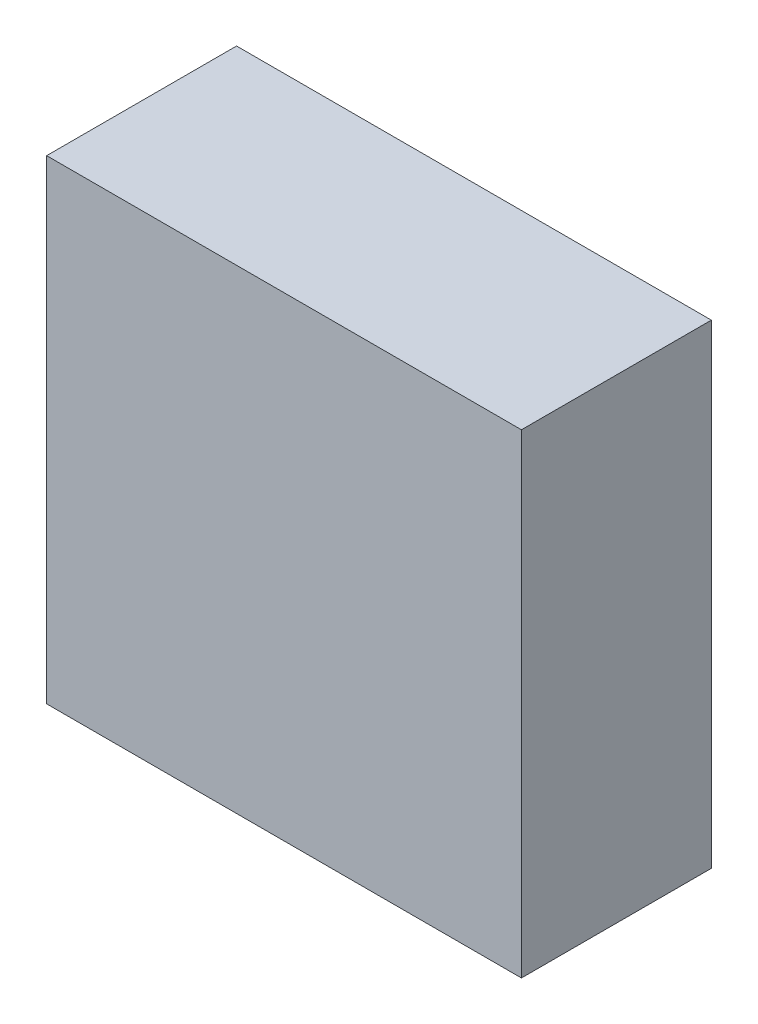
ISO-10303-21;
HEADER;
FILE_DESCRIPTION(('STEP AP214'),'2;1');
FILE_NAME('part.step','',(''),(''),'','','');
FILE_SCHEMA(('AUTOMOTIVE_DESIGN { 1 0 10303 214 1 1 1 1 }'));
ENDSEC;
DATA;
#1=APPLICATION_CONTEXT('core data for automotive mechanical design processes');
#2=APPLICATION_PROTOCOL_DEFINITION('international standard','automotive_design',2000,#1);
#3=PRODUCT_CONTEXT('',#1,'mechanical');
#4=PRODUCT('Part','Part','',(#3));
#5=PRODUCT_RELATED_PRODUCT_CATEGORY('part','',(#4));
#6=PRODUCT_DEFINITION_FORMATION('','',#4);
#7=PRODUCT_DEFINITION_CONTEXT('part definition',#1,'design');
#8=PRODUCT_DEFINITION('design','',#6,#7);
#9=PRODUCT_DEFINITION_SHAPE('','',#8);
#10=(LENGTH_UNIT() NAMED_UNIT(*) SI_UNIT(.MILLI.,.METRE.));
#11=(NAMED_UNIT(*) PLANE_ANGLE_UNIT() SI_UNIT($,.RADIAN.));
#12=(NAMED_UNIT(*) SI_UNIT($,.STERADIAN.) SOLID_ANGLE_UNIT());
#13=UNCERTAINTY_MEASURE_WITH_UNIT(LENGTH_MEASURE(1.E-05),#10,'distance_accuracy_value','');
#14=(GEOMETRIC_REPRESENTATION_CONTEXT(3) GLOBAL_UNCERTAINTY_ASSIGNED_CONTEXT((#13)) GLOBAL_UNIT_ASSIGNED_CONTEXT((#10,
#11,#12)) REPRESENTATION_CONTEXT('',''));
#15=CARTESIAN_POINT('',(0.,0.,0.));
#16=DIRECTION('',(0.,0.,1.));
#17=DIRECTION('',(1.,0.,0.));
#18=AXIS2_PLACEMENT_3D('',#15,#16,#17);
#19=CARTESIAN_POINT('',(25.9471990727128,3.78096775519939,-0.879999050681724));
#20=CARTESIAN_POINT('',(23.5471990727128,3.7809677838191,-0.879999050681722));
#21=CARTESIAN_POINT('',(25.9471990727128,3.78096767127356,0.0800009493182734));
#22=CARTESIAN_POINT('',(23.5471990727128,3.78096769989328,0.0800009493182759));
#23=(BOUNDED_SURFACE() B_SPLINE_SURFACE(1,1,((#19,#20),(#21,#22)),.UNSPECIFIED.,.F.,.F.,
.F.) B_SPLINE_SURFACE_WITH_KNOTS((2,2),(2,2),(-8.E-05,0.00088),(-0.0022,0.000200000000000007),
.UNSPECIFIED.) GEOMETRIC_REPRESENTATION_ITEM() RATIONAL_B_SPLINE_SURFACE(((1.,1.),(1.,1.))) REPRESENTATION_ITEM('') SURFACE());
#24=CARTESIAN_POINT('',(23.7471990727128,3.78096777444031,-0.799999050681722));
#25=CARTESIAN_POINT('',(25.7471990727128,3.78096775059055,-0.799999050681724));
#26=(BOUNDED_CURVE() B_SPLINE_CURVE(1,(#24,#25),.UNSPECIFIED.,.F.,
.F.) B_SPLINE_CURVE_WITH_KNOTS((2,2),(0.,0.002),
.UNSPECIFIED.) CURVE() GEOMETRIC_REPRESENTATION_ITEM() RATIONAL_B_SPLINE_CURVE((1.,1.)) REPRESENTATION_ITEM(''));
#27=CARTESIAN_POINT('',(23.7471990727128,3.78096777444031,-0.799999050681722));
#28=VERTEX_POINT('',#27);
#29=CARTESIAN_POINT('',(25.7471990727128,3.78096775059056,-0.799999050681724));
#30=VERTEX_POINT('',#29);
#31=EDGE_CURVE('E43',#28,#30,#26,.T.);
#32=CARTESIAN_POINT('',(25.7471990727128,3.78096768065236,9.49318273730376E-07));
#33=CARTESIAN_POINT('',(25.7471990727128,3.78096775059055,-0.799999050681724));
#34=(BOUNDED_CURVE() B_SPLINE_CURVE(1,(#32,#33),.UNSPECIFIED.,.F.,
.F.) B_SPLINE_CURVE_WITH_KNOTS((2,2),(0.,0.0008),
.UNSPECIFIED.) CURVE() GEOMETRIC_REPRESENTATION_ITEM() RATIONAL_B_SPLINE_CURVE((1.,1.)) REPRESENTATION_ITEM(''));
#35=CARTESIAN_POINT('',(25.7471990727128,3.78096768065236,9.49318273730376E-07));
#36=VERTEX_POINT('',#35);
#37=EDGE_CURVE('E128',#36,#30,#34,.T.);
#38=CARTESIAN_POINT('',(23.7471990727128,3.78096770450212,9.49318275898781E-07));
#39=CARTESIAN_POINT('',(25.7471990727128,3.78096768065236,9.4931827381377E-07));
#40=(BOUNDED_CURVE() B_SPLINE_CURVE(1,(#38,#39),.UNSPECIFIED.,.F.,
.F.) B_SPLINE_CURVE_WITH_KNOTS((2,2),(0.,0.002),
.UNSPECIFIED.) CURVE() GEOMETRIC_REPRESENTATION_ITEM() RATIONAL_B_SPLINE_CURVE((1.,1.)) REPRESENTATION_ITEM(''));
#41=CARTESIAN_POINT('',(23.7471990727128,3.78096770450212,9.49318275898781E-07));
#42=VERTEX_POINT('',#41);
#43=EDGE_CURVE('E91',#42,#36,#40,.T.);
#44=CARTESIAN_POINT('',(23.7471990727128,3.78096770450212,9.49318275898781E-07));
#45=CARTESIAN_POINT('',(23.7471990727128,3.78096777444031,-0.799999050681722));
#46=(BOUNDED_CURVE() B_SPLINE_CURVE(1,(#44,#45),.UNSPECIFIED.,.F.,
.F.) B_SPLINE_CURVE_WITH_KNOTS((2,2),(0.,0.0008),
.UNSPECIFIED.) CURVE() GEOMETRIC_REPRESENTATION_ITEM() RATIONAL_B_SPLINE_CURVE((1.,1.)) REPRESENTATION_ITEM(''));
#47=EDGE_CURVE('E11',#42,#28,#46,.T.);
#48=ORIENTED_EDGE('',*,*,#31,.T.);
#49=ORIENTED_EDGE('',*,*,#37,.F.);
#50=ORIENTED_EDGE('',*,*,#43,.F.);
#51=ORIENTED_EDGE('',*,*,#47,.T.);
#52=EDGE_LOOP('',(#48,#49,#50,#51));
#53=FACE_BOUND('',#52,.T.);
#54=ADVANCED_FACE('F17',(#53),#23,.T.);
#55=CARTESIAN_POINT('',(23.7471990703278,3.58096778143412,-0.879999068166268));
#56=CARTESIAN_POINT('',(23.7471990989475,5.98096778143414,-0.879998858351707));
#57=CARTESIAN_POINT('',(23.7471990703278,3.5809676975083,0.080000931833729));
#58=CARTESIAN_POINT('',(23.7471990989475,5.98096769750832,0.0800011416482905));
#59=(BOUNDED_SURFACE() B_SPLINE_SURFACE(1,1,((#55,#56),(#57,#58)),.UNSPECIFIED.,.F.,.F.,
.F.) B_SPLINE_SURFACE_WITH_KNOTS((2,2),(2,2),(-8.E-05,0.00088),(-0.000200000000000003,0.0022),
.UNSPECIFIED.) GEOMETRIC_REPRESENTATION_ITEM() RATIONAL_B_SPLINE_SURFACE(((1.,1.),(1.,1.))) REPRESENTATION_ITEM('') SURFACE());
#60=CARTESIAN_POINT('',(23.7471990965625,5.78096770450212,1.12416374386387E-06));
#61=CARTESIAN_POINT('',(23.7471990965625,5.78096777444031,-0.799998875836254));
#62=(BOUNDED_CURVE() B_SPLINE_CURVE(1,(#60,#61),.UNSPECIFIED.,.F.,
.F.) B_SPLINE_CURVE_WITH_KNOTS((2,2),(0.,0.0008),
.UNSPECIFIED.) CURVE() GEOMETRIC_REPRESENTATION_ITEM() RATIONAL_B_SPLINE_CURVE((1.,1.)) REPRESENTATION_ITEM(''));
#63=CARTESIAN_POINT('',(23.7471990965625,5.78096770450212,1.12416374386387E-06));
#64=VERTEX_POINT('',#63);
#65=CARTESIAN_POINT('',(23.7471990965625,5.78096777444032,-0.799998875836254));
#66=VERTEX_POINT('',#65);
#67=EDGE_CURVE('E104',#64,#66,#62,.T.);
#68=CARTESIAN_POINT('',(23.7471990727128,3.78096777444031,-0.799999050681722));
#69=CARTESIAN_POINT('',(23.7471990965626,5.78096777444032,-0.799998875836254));
#70=(BOUNDED_CURVE() B_SPLINE_CURVE(1,(#68,#69),.UNSPECIFIED.,.F.,
.F.) B_SPLINE_CURVE_WITH_KNOTS((2,2),(0.,0.002),
.UNSPECIFIED.) CURVE() GEOMETRIC_REPRESENTATION_ITEM() RATIONAL_B_SPLINE_CURVE((1.,1.)) REPRESENTATION_ITEM(''));
#71=EDGE_CURVE('E31',#28,#66,#70,.T.);
#72=CARTESIAN_POINT('',(23.7471990727128,3.78096770450212,9.49318275898781E-07));
#73=CARTESIAN_POINT('',(23.7471990965626,5.78096770450212,1.1241637437806E-06));
#74=(BOUNDED_CURVE() B_SPLINE_CURVE(1,(#72,#73),.UNSPECIFIED.,.F.,
.F.) B_SPLINE_CURVE_WITH_KNOTS((2,2),(0.,0.002),
.UNSPECIFIED.) CURVE() GEOMETRIC_REPRESENTATION_ITEM() RATIONAL_B_SPLINE_CURVE((1.,1.)) REPRESENTATION_ITEM(''));
#75=EDGE_CURVE('E93',#42,#64,#74,.T.);
#76=ORIENTED_EDGE('',*,*,#67,.T.);
#77=ORIENTED_EDGE('',*,*,#71,.F.);
#78=ORIENTED_EDGE('',*,*,#47,.F.);
#79=ORIENTED_EDGE('',*,*,#75,.T.);
#80=EDGE_LOOP('',(#76,#77,#78,#79));
#81=FACE_BOUND('',#80,.T.);
#82=ADVANCED_FACE('F351',(#81),#59,.T.);
#83=CARTESIAN_POINT('',(23.5471990703278,3.58096777682529,-0.799999068166268));
#84=CARTESIAN_POINT('',(25.9471990703278,3.58096774820557,-0.799999068166271));
#85=CARTESIAN_POINT('',(23.5471990989475,5.9809677768253,-0.799998858351707));
#86=CARTESIAN_POINT('',(25.9471990989475,5.98096774820558,-0.79999885835171));
#87=(BOUNDED_SURFACE() B_SPLINE_SURFACE(1,1,((#83,#84),(#85,#86)),.UNSPECIFIED.,.F.,.F.,
.F.) B_SPLINE_SURFACE_WITH_KNOTS((2,2),(2,2),(-0.0002,0.0022),(-0.000200000000000068,0.0022),
.UNSPECIFIED.) GEOMETRIC_REPRESENTATION_ITEM() RATIONAL_B_SPLINE_SURFACE(((1.,1.),(1.,1.))) REPRESENTATION_ITEM('') SURFACE());
#88=CARTESIAN_POINT('',(25.4138657448454,4.23930108789851,-0.79999901061297));
#89=CARTESIAN_POINT('',(25.5388657448454,4.23930108640791,-0.799999010612971));
#90=CARTESIAN_POINT('',(25.5388657433548,4.1143010864079,-0.799999021540812));
#91=CARTESIAN_POINT('',(25.5388657418642,3.9893010864079,-0.799999032468654));
#92=CARTESIAN_POINT('',(25.4138657418642,3.98930108789851,-0.799999032468654));
#93=(BOUNDED_CURVE() B_SPLINE_CURVE(2,(#88,#89,#90,#91,#92),.UNSPECIFIED.,.F.,
.F.) B_SPLINE_CURVE_WITH_KNOTS((3,2,3),(0.,1.57079632679488,3.14159265358981),
.UNSPECIFIED.) CURVE() GEOMETRIC_REPRESENTATION_ITEM() RATIONAL_B_SPLINE_CURVE((1.,
0.707106781186544,1.,0.70710678118653,1.)) REPRESENTATION_ITEM(''));
#94=CARTESIAN_POINT('',(25.4138657448454,4.23930108789851,-0.79999901061297));
#95=VERTEX_POINT('',#94);
#96=CARTESIAN_POINT('',(25.4138657418642,3.98930108789849,-0.799999032468654));
#97=VERTEX_POINT('',#96);
#98=EDGE_CURVE('E68',#95,#97,#93,.T.);
#99=CARTESIAN_POINT('',(25.4138657418642,3.98930108789851,-0.799999032468654));
#100=CARTESIAN_POINT('',(25.2888657418642,3.98930108938912,-0.799999032468654));
#101=CARTESIAN_POINT('',(25.2888657433548,4.11430108938912,-0.799999021540812));
#102=CARTESIAN_POINT('',(25.2888657448454,4.23930108938911,-0.79999901061297));
#103=CARTESIAN_POINT('',(25.4138657448454,4.23930108789851,-0.79999901061297));
#104=(BOUNDED_CURVE() B_SPLINE_CURVE(2,(#99,#100,#101,#102,#103),.UNSPECIFIED.,.F.,
.F.) B_SPLINE_CURVE_WITH_KNOTS((3,2,3),(3.14159265358981,4.71238898038467,6.28318530717953),
.UNSPECIFIED.) CURVE() GEOMETRIC_REPRESENTATION_ITEM() RATIONAL_B_SPLINE_CURVE((1.,
0.707106781186491,1.,0.707106781186478,1.)) REPRESENTATION_ITEM(''));
#105=EDGE_CURVE('E127',#97,#95,#104,.T.);
#106=CARTESIAN_POINT('',(23.7471990965625,5.78096777444032,-0.799998875836254));
#107=CARTESIAN_POINT('',(25.7471990965625,5.78096775059056,-0.799998875836256));
#108=(BOUNDED_CURVE() B_SPLINE_CURVE(1,(#106,#107),.UNSPECIFIED.,.F.,
.F.) B_SPLINE_CURVE_WITH_KNOTS((2,2),(0.,0.002),
.UNSPECIFIED.) CURVE() GEOMETRIC_REPRESENTATION_ITEM() RATIONAL_B_SPLINE_CURVE((1.,1.)) REPRESENTATION_ITEM(''));
#109=CARTESIAN_POINT('',(25.7471990965625,5.78096775059053,-0.799998875836256));
#110=VERTEX_POINT('',#109);
#111=EDGE_CURVE('E23',#66,#110,#108,.T.);
#112=CARTESIAN_POINT('',(25.7471990727128,3.78096775059056,-0.799999050681724));
#113=CARTESIAN_POINT('',(25.7471990965626,5.78096775059053,-0.799998875836256));
#114=(BOUNDED_CURVE() B_SPLINE_CURVE(1,(#112,#113),.UNSPECIFIED.,.F.,
.F.) B_SPLINE_CURVE_WITH_KNOTS((2,2),(0.,0.00199999999999997),
.UNSPECIFIED.) CURVE() GEOMETRIC_REPRESENTATION_ITEM() RATIONAL_B_SPLINE_CURVE((1.,1.)) REPRESENTATION_ITEM(''));
#115=EDGE_CURVE('E78',#30,#110,#114,.T.);
#116=ORIENTED_EDGE('',*,*,#98,.F.);
#117=ORIENTED_EDGE('',*,*,#105,.F.);
#118=EDGE_LOOP('',(#116,#117));
#119=FACE_BOUND('',#118,.T.);
#120=ORIENTED_EDGE('',*,*,#31,.F.);
#121=ORIENTED_EDGE('',*,*,#71,.T.);
#122=ORIENTED_EDGE('',*,*,#111,.T.);
#123=ORIENTED_EDGE('',*,*,#115,.F.);
#124=EDGE_LOOP('',(#120,#121,#122,#123));
#125=FACE_BOUND('',#124,.T.);
#126=ADVANCED_FACE('F19',(#119,#125),#87,.T.);
#127=CARTESIAN_POINT('',(25.7471990703278,3.58096767365854,0.0800009318337268));
#128=CARTESIAN_POINT('',(25.7471990989475,5.98096767365855,0.0800011416482883));
#129=CARTESIAN_POINT('',(25.7471990703278,3.58096775758436,-0.879999068166271));
#130=CARTESIAN_POINT('',(25.7471990989475,5.98096775758438,-0.879998858351709));
#131=(BOUNDED_SURFACE() B_SPLINE_SURFACE(1,1,((#127,#128),(#129,#130)),.UNSPECIFIED.,.F.,.F.,
.F.) B_SPLINE_SURFACE_WITH_KNOTS((2,2),(2,2),(-8.E-05,0.00088),(-0.000200000000000003,0.0022),
.UNSPECIFIED.) GEOMETRIC_REPRESENTATION_ITEM() RATIONAL_B_SPLINE_SURFACE(((1.,1.),(1.,1.))) REPRESENTATION_ITEM('') SURFACE());
#132=CARTESIAN_POINT('',(25.7471990727128,3.78096768065236,9.49318273730376E-07));
#133=CARTESIAN_POINT('',(25.7471990965626,5.78096768065237,1.1241637416122E-06));
#134=(BOUNDED_CURVE() B_SPLINE_CURVE(1,(#132,#133),.UNSPECIFIED.,.F.,
.F.) B_SPLINE_CURVE_WITH_KNOTS((2,2),(0.,0.002),
.UNSPECIFIED.) CURVE() GEOMETRIC_REPRESENTATION_ITEM() RATIONAL_B_SPLINE_CURVE((1.,1.)) REPRESENTATION_ITEM(''));
#135=CARTESIAN_POINT('',(25.7471990965625,5.78096768065237,1.12416374169547E-06));
#136=VERTEX_POINT('',#135);
#137=EDGE_CURVE('E85',#36,#136,#134,.T.);
#138=CARTESIAN_POINT('',(25.7471990965625,5.78096768065237,1.12416374169547E-06));
#139=CARTESIAN_POINT('',(25.7471990965625,5.78096775059056,-0.799998875836256));
#140=(BOUNDED_CURVE() B_SPLINE_CURVE(1,(#138,#139),.UNSPECIFIED.,.F.,
.F.) B_SPLINE_CURVE_WITH_KNOTS((2,2),(0.,0.0008),
.UNSPECIFIED.) CURVE() GEOMETRIC_REPRESENTATION_ITEM() RATIONAL_B_SPLINE_CURVE((1.,1.)) REPRESENTATION_ITEM(''));
#141=EDGE_CURVE('E96',#136,#110,#140,.T.);
#142=ORIENTED_EDGE('',*,*,#137,.F.);
#143=ORIENTED_EDGE('',*,*,#37,.T.);
#144=ORIENTED_EDGE('',*,*,#115,.T.);
#145=ORIENTED_EDGE('',*,*,#141,.F.);
#146=EDGE_LOOP('',(#142,#143,#144,#145));
#147=FACE_BOUND('',#146,.T.);
#148=ADVANCED_FACE('F97',(#147),#131,.T.);
#149=CARTESIAN_POINT('',(23.5471990989475,5.98096770688711,1.14164829077728E-06));
#150=CARTESIAN_POINT('',(25.9471990989475,5.98096767826739,1.14164828827527E-06));
#151=CARTESIAN_POINT('',(23.5471990703278,3.58096770688709,9.318337293191E-07));
#152=CARTESIAN_POINT('',(25.9471990703278,3.58096767826738,9.31833726817086E-07));
#153=(BOUNDED_SURFACE() B_SPLINE_SURFACE(1,1,((#149,#150),(#151,#152)),.UNSPECIFIED.,.F.,.F.,
.F.) B_SPLINE_SURFACE_WITH_KNOTS((2,2),(2,2),(-0.0002,0.0022),(-0.000200000000000069,0.0022),
.UNSPECIFIED.) GEOMETRIC_REPRESENTATION_ITEM() RATIONAL_B_SPLINE_SURFACE(((1.,1.),(1.,1.))) REPRESENTATION_ITEM('') SURFACE());
#154=CARTESIAN_POINT('',(23.7471990965625,5.78096770450212,1.12416374386387E-06));
#155=CARTESIAN_POINT('',(25.7471990965625,5.78096768065236,1.12416374177886E-06));
#156=(BOUNDED_CURVE() B_SPLINE_CURVE(1,(#154,#155),.UNSPECIFIED.,.F.,
.F.) B_SPLINE_CURVE_WITH_KNOTS((2,2),(0.,0.002),
.UNSPECIFIED.) CURVE() GEOMETRIC_REPRESENTATION_ITEM() RATIONAL_B_SPLINE_CURVE((1.,1.)) REPRESENTATION_ITEM(''));
#157=EDGE_CURVE('E89',#64,#136,#156,.T.);
#158=ORIENTED_EDGE('',*,*,#137,.T.);
#159=ORIENTED_EDGE('',*,*,#157,.F.);
#160=ORIENTED_EDGE('',*,*,#75,.F.);
#161=ORIENTED_EDGE('',*,*,#43,.T.);
#162=EDGE_LOOP('',(#158,#159,#160,#161));
#163=FACE_BOUND('',#162,.T.);
#164=ADVANCED_FACE('F86',(#163),#153,.T.);
#165=CARTESIAN_POINT('',(25.9471990965625,5.78096767127356,0.0800011241637414));
#166=CARTESIAN_POINT('',(23.5471990965625,5.78096769989328,0.0800011241637439));
#167=CARTESIAN_POINT('',(25.9471990965625,5.78096775519939,-0.879998875836256));
#168=CARTESIAN_POINT('',(23.5471990965625,5.7809677838191,-0.879998875836254));
#169=(BOUNDED_SURFACE() B_SPLINE_SURFACE(1,1,((#165,#166),(#167,#168)),.UNSPECIFIED.,.F.,.F.,
.F.) B_SPLINE_SURFACE_WITH_KNOTS((2,2),(2,2),(-8.E-05,0.00088),(-0.0022,0.0002),
.UNSPECIFIED.) GEOMETRIC_REPRESENTATION_ITEM() RATIONAL_B_SPLINE_SURFACE(((1.,1.),(1.,1.))) REPRESENTATION_ITEM('') SURFACE());
#170=ORIENTED_EDGE('',*,*,#67,.F.);
#171=ORIENTED_EDGE('',*,*,#157,.T.);
#172=ORIENTED_EDGE('',*,*,#141,.T.);
#173=ORIENTED_EDGE('',*,*,#111,.F.);
#174=EDGE_LOOP('',(#170,#171,#172,#173));
#175=FACE_BOUND('',#174,.T.);
#176=ADVANCED_FACE('F102',(#175),#169,.T.);
#177=CARTESIAN_POINT('',(25.4138657418642,3.98930107915622,-0.699999032468655));
#178=CARTESIAN_POINT('',(25.2888657418642,3.98930108064683,-0.699999032468654));
#179=CARTESIAN_POINT('',(25.2888657433548,4.11430108064683,-0.699999021540813));
#180=CARTESIAN_POINT('',(25.2888657448454,4.23930108064683,-0.699999010612971));
#181=CARTESIAN_POINT('',(25.4138657448454,4.23930107915622,-0.699999010612971));
#182=CARTESIAN_POINT('',(25.5388657448454,4.23930107766561,-0.699999010612971));
#183=CARTESIAN_POINT('',(25.5388657433548,4.11430107766561,-0.699999021540813));
#184=CARTESIAN_POINT('',(25.5388657418642,3.98930107766561,-0.699999032468656));
#185=CARTESIAN_POINT('',(25.4138657418642,3.98930107915622,-0.699999032468655));
#186=CARTESIAN_POINT('',(25.4138657418642,3.98930108789849,-0.799999032468654));
#187=CARTESIAN_POINT('',(25.2888657418642,3.98930108938911,-0.799999032468655));
#188=CARTESIAN_POINT('',(25.2888657433548,4.11430108938911,-0.799999021540812));
#189=CARTESIAN_POINT('',(25.2888657448454,4.23930108938911,-0.79999901061297));
#190=CARTESIAN_POINT('',(25.4138657448454,4.23930108789849,-0.79999901061297));
#191=CARTESIAN_POINT('',(25.5388657448454,4.23930108640788,-0.799999010612971));
#192=CARTESIAN_POINT('',(25.5388657433548,4.11430108640788,-0.799999021540812));
#193=CARTESIAN_POINT('',(25.5388657418642,3.98930108640788,-0.799999032468655));
#194=CARTESIAN_POINT('',(25.4138657418642,3.98930108789849,-0.799999032468654));
#195=(BOUNDED_SURFACE() B_SPLINE_SURFACE(1,2,((#177,#178,#179,#180,#181,#182,#183,#184,#185),
(#186,#187,#188,#189,#190,#191,#192,#193,#194)),.UNSPECIFIED.,.F.,.T.,
.F.) B_SPLINE_SURFACE_WITH_KNOTS((2,2),(3,2,2,2,3),(0.,0.8),(-3.14159265358979,-1.5707963267949,
0.,1.5707963267949,3.14159265358979),
.UNSPECIFIED.) GEOMETRIC_REPRESENTATION_ITEM() RATIONAL_B_SPLINE_SURFACE(((1.,0.707106781186548,
1.,0.707106781186548,1.,0.707106781186548,1.,0.707106781186548,1.),(1.,0.707106781186548,1.,
0.707106781186548,1.,0.707106781186548,1.,0.707106781186548,1.))) REPRESENTATION_ITEM('') SURFACE());
#196=CARTESIAN_POINT('',(25.4138657448454,4.23930107915622,-0.699999010612971));
#197=CARTESIAN_POINT('',(25.5388657448454,4.23930107766562,-0.699999010612971));
#198=CARTESIAN_POINT('',(25.5388657433548,4.11430107766561,-0.699999021540813));
#199=CARTESIAN_POINT('',(25.5388657418642,3.98930107766561,-0.699999032468655));
#200=CARTESIAN_POINT('',(25.4138657418642,3.98930107915622,-0.699999032468655));
#201=(BOUNDED_CURVE() B_SPLINE_CURVE(2,(#196,#197,#198,#199,#200),.UNSPECIFIED.,.F.,
.F.) B_SPLINE_CURVE_WITH_KNOTS((3,2,3),(0.,1.57079632679488,3.14159265358981),
.UNSPECIFIED.) CURVE() GEOMETRIC_REPRESENTATION_ITEM() RATIONAL_B_SPLINE_CURVE((1.,
0.707106781186544,1.,0.70710678118653,1.)) REPRESENTATION_ITEM(''));
#202=CARTESIAN_POINT('',(25.4138657448454,4.23930107915622,-0.699999010612971));
#203=VERTEX_POINT('',#202);
#204=CARTESIAN_POINT('',(25.4138657418642,3.98930107915622,-0.699999032468655));
#205=VERTEX_POINT('',#204);
#206=EDGE_CURVE('E150',#203,#205,#201,.T.);
#207=CARTESIAN_POINT('',(25.4138657418642,3.98930107915622,-0.699999032468655));
#208=CARTESIAN_POINT('',(25.2888657418642,3.98930108064683,-0.699999032468654));
#209=CARTESIAN_POINT('',(25.2888657433548,4.11430108064683,-0.699999021540813));
#210=CARTESIAN_POINT('',(25.2888657448454,4.23930108064682,-0.699999010612971));
#211=CARTESIAN_POINT('',(25.4138657448454,4.23930107915622,-0.699999010612971));
#212=(BOUNDED_CURVE() B_SPLINE_CURVE(2,(#207,#208,#209,#210,#211),.UNSPECIFIED.,.F.,
.F.) B_SPLINE_CURVE_WITH_KNOTS((3,2,3),(3.14159265358981,4.71238898038467,6.28318530717953),
.UNSPECIFIED.) CURVE() GEOMETRIC_REPRESENTATION_ITEM() RATIONAL_B_SPLINE_CURVE((1.,
0.707106781186504,1.,0.707106781186478,1.)) REPRESENTATION_ITEM(''));
#213=EDGE_CURVE('E143',#205,#203,#212,.T.);
#214=CARTESIAN_POINT('',(25.4138657418642,3.98930107915622,-0.699999032468655));
#215=CARTESIAN_POINT('',(25.4138657418642,3.98930108789849,-0.799999032468654));
#216=(BOUNDED_CURVE() B_SPLINE_CURVE(1,(#214,#215),.UNSPECIFIED.,.F.,
.F.) B_SPLINE_CURVE_WITH_KNOTS((2,2),(0.,0.8),
.UNSPECIFIED.) CURVE() GEOMETRIC_REPRESENTATION_ITEM() RATIONAL_B_SPLINE_CURVE((1.,1.)) REPRESENTATION_ITEM(''));
#217=EDGE_CURVE('E116',#205,#97,#216,.T.);
#218=ORIENTED_EDGE('',*,*,#206,.F.);
#219=ORIENTED_EDGE('',*,*,#213,.F.);
#220=ORIENTED_EDGE('',*,*,#217,.T.);
#221=ORIENTED_EDGE('',*,*,#105,.T.);
#222=ORIENTED_EDGE('',*,*,#98,.T.);
#223=ORIENTED_EDGE('',*,*,#217,.F.);
#224=EDGE_LOOP('',(#218,#219,#220,#221,#222,#223));
#225=FACE_BOUND('',#224,.T.);
#226=ADVANCED_FACE('F331',(#225),#195,.T.);
#227=CARTESIAN_POINT('',(25.2638657415661,3.96430108094494,-0.699999034654223));
#228=CARTESIAN_POINT('',(25.5638657415661,3.96430107736748,-0.699999034654223));
#229=CARTESIAN_POINT('',(25.2638657451435,4.26430108094496,-0.699999008427403));
#230=CARTESIAN_POINT('',(25.5638657451435,4.2643010773675,-0.699999008427403));
#231=(BOUNDED_SURFACE() B_SPLINE_SURFACE(1,1,((#227,#228),(#229,#230)),.UNSPECIFIED.,.F.,.F.,
.F.) B_SPLINE_SURFACE_WITH_KNOTS((2,2),(2,2),(-0.000150000000000007,0.000150000000000008),
(-0.000150000000000009,0.000150000000000012),
.UNSPECIFIED.) GEOMETRIC_REPRESENTATION_ITEM() RATIONAL_B_SPLINE_SURFACE(((1.,1.),(1.,1.))) REPRESENTATION_ITEM('') SURFACE());
#232=ORIENTED_EDGE('',*,*,#206,.T.);
#233=ORIENTED_EDGE('',*,*,#213,.T.);
#234=EDGE_LOOP('',(#232,#233));
#235=FACE_BOUND('',#234,.T.);
#236=ADVANCED_FACE('F327',(#235),#231,.T.);
#237=CLOSED_SHELL('',(#54,#82,#126,#148,#164,#176,#226,#236));
#238=MANIFOLD_SOLID_BREP('B1',#237);
#239=ADVANCED_BREP_SHAPE_REPRESENTATION('',(#18,#238),#14);
#240=SHAPE_DEFINITION_REPRESENTATION(#9,#239);
ENDSEC;
END-ISO-10303-21;
